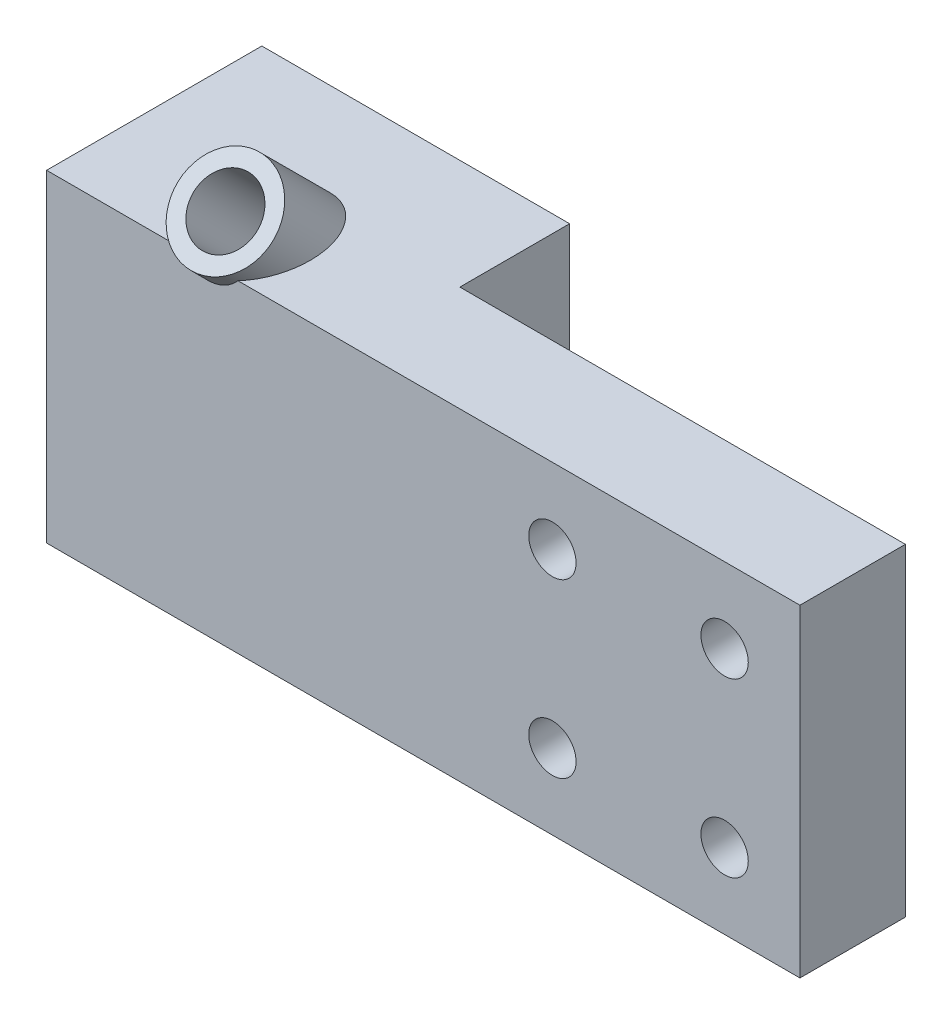
ISO-10303-21;
HEADER;
FILE_DESCRIPTION(('STEP AP214'),'2;1');
FILE_NAME('part.step','',(''),(''),'','','');
FILE_SCHEMA(('AUTOMOTIVE_DESIGN { 1 0 10303 214 1 1 1 1 }'));
ENDSEC;
DATA;
#1=APPLICATION_CONTEXT('core data for automotive mechanical design processes');
#2=APPLICATION_PROTOCOL_DEFINITION('international standard','automotive_design',2000,#1);
#3=PRODUCT_CONTEXT('',#1,'mechanical');
#4=PRODUCT('Part','Part','',(#3));
#5=PRODUCT_RELATED_PRODUCT_CATEGORY('part','',(#4));
#6=PRODUCT_DEFINITION_FORMATION('','',#4);
#7=PRODUCT_DEFINITION_CONTEXT('part definition',#1,'design');
#8=PRODUCT_DEFINITION('design','',#6,#7);
#9=PRODUCT_DEFINITION_SHAPE('','',#8);
#10=(LENGTH_UNIT() NAMED_UNIT(*) SI_UNIT(.MILLI.,.METRE.));
#11=(NAMED_UNIT(*) PLANE_ANGLE_UNIT() SI_UNIT($,.RADIAN.));
#12=(NAMED_UNIT(*) SI_UNIT($,.STERADIAN.) SOLID_ANGLE_UNIT());
#13=UNCERTAINTY_MEASURE_WITH_UNIT(LENGTH_MEASURE(1.E-05),#10,'distance_accuracy_value','');
#14=(GEOMETRIC_REPRESENTATION_CONTEXT(3) GLOBAL_UNCERTAINTY_ASSIGNED_CONTEXT((#13)) GLOBAL_UNIT_ASSIGNED_CONTEXT((#10,
#11,#12)) REPRESENTATION_CONTEXT('',''));
#15=CARTESIAN_POINT('',(0.,0.,0.));
#16=DIRECTION('',(0.,0.,1.));
#17=DIRECTION('',(1.,0.,0.));
#18=AXIS2_PLACEMENT_3D('',#15,#16,#17);
#19=CARTESIAN_POINT('',(0.,0.,-4.));
#20=DIRECTION('',(0.,0.,-1.));
#21=DIRECTION('',(1.,0.,0.));
#22=AXIS2_PLACEMENT_3D('',#19,#20,#21);
#23=PLANE('',#22);
#24=CARTESIAN_POINT('',(7.5,-7.5,-4.));
#25=DIRECTION('',(0.,0.,1.));
#26=DIRECTION('',(0.,-1.,0.));
#27=AXIS2_PLACEMENT_3D('',#24,#25,#26);
#28=ELLIPSE('',#27,3.18198051533947,2.25);
#29=CARTESIAN_POINT('',(7.5,-10.6819805153395,-4.));
#30=VERTEX_POINT('',#29);
#31=EDGE_CURVE('E11',#30,#30,#28,.T.);
#32=ORIENTED_EDGE('',*,*,#31,.T.);
#33=EDGE_LOOP('',(#32));
#34=FACE_BOUND('',#33,.T.);
#35=DIRECTION('',(1.,0.,0.));
#36=VECTOR('',#35,1.);
#37=CARTESIAN_POINT('',(0.,-15.,-4.));
#38=LINE('',#37,#36);
#39=CARTESIAN_POINT('',(0.,-15.,-4.));
#40=VERTEX_POINT('',#39);
#41=CARTESIAN_POINT('',(14.3,-15.,-4.));
#42=VERTEX_POINT('',#41);
#43=EDGE_CURVE('E121',#40,#42,#38,.T.);
#44=ORIENTED_EDGE('',*,*,#43,.F.);
#45=DIRECTION('',(0.,-1.,0.));
#46=VECTOR('',#45,1.);
#47=CARTESIAN_POINT('',(0.,0.,-4.));
#48=LINE('',#47,#46);
#49=CARTESIAN_POINT('',(0.,0.,-4.));
#50=VERTEX_POINT('',#49);
#51=EDGE_CURVE('E129',#50,#40,#48,.T.);
#52=ORIENTED_EDGE('',*,*,#51,.F.);
#53=DIRECTION('',(-1.,0.,0.));
#54=VECTOR('',#53,1.);
#55=CARTESIAN_POINT('',(0.,0.,-4.));
#56=LINE('',#55,#54);
#57=CARTESIAN_POINT('',(14.3,0.,-4.));
#58=VERTEX_POINT('',#57);
#59=EDGE_CURVE('E123',#58,#50,#56,.T.);
#60=ORIENTED_EDGE('',*,*,#59,.F.);
#61=DIRECTION('',(0.,-1.,0.));
#62=VECTOR('',#61,1.);
#63=CARTESIAN_POINT('',(14.3,0.,-4.));
#64=LINE('',#63,#62);
#65=EDGE_CURVE('E109',#58,#42,#64,.T.);
#66=ORIENTED_EDGE('',*,*,#65,.T.);
#67=EDGE_LOOP('',(#44,#52,#60,#66));
#68=FACE_BOUND('',#67,.T.);
#69=ADVANCED_FACE('F41',(#34,#68),#23,.T.);
#70=CARTESIAN_POINT('',(0.,0.,-4.));
#71=DIRECTION('',(1.,0.,0.));
#72=DIRECTION('',(0.,1.,0.));
#73=AXIS2_PLACEMENT_3D('',#70,#71,#72);
#74=PLANE('',#73);
#75=DIRECTION('',(0.,0.,1.));
#76=VECTOR('',#75,1.);
#77=CARTESIAN_POINT('',(0.,0.,-4.));
#78=LINE('',#77,#76);
#79=CARTESIAN_POINT('',(0.,0.,6.));
#80=VERTEX_POINT('',#79);
#81=EDGE_CURVE('E132',#50,#80,#78,.T.);
#82=ORIENTED_EDGE('',*,*,#81,.F.);
#83=ORIENTED_EDGE('',*,*,#51,.T.);
#84=DIRECTION('',(0.,0.,1.));
#85=VECTOR('',#84,1.);
#86=CARTESIAN_POINT('',(0.,-15.,-4.));
#87=LINE('',#86,#85);
#88=CARTESIAN_POINT('',(0.,-15.,6.));
#89=VERTEX_POINT('',#88);
#90=EDGE_CURVE('E130',#40,#89,#87,.T.);
#91=ORIENTED_EDGE('',*,*,#90,.T.);
#92=DIRECTION('',(0.,-1.,0.));
#93=VECTOR('',#92,1.);
#94=CARTESIAN_POINT('',(0.,0.,6.));
#95=LINE('',#94,#93);
#96=EDGE_CURVE('E152',#80,#89,#95,.T.);
#97=ORIENTED_EDGE('',*,*,#96,.F.);
#98=EDGE_LOOP('',(#82,#83,#91,#97));
#99=FACE_BOUND('',#98,.T.);
#100=ADVANCED_FACE('F43',(#99),#74,.F.);
#101=CARTESIAN_POINT('',(0.,-15.,-4.));
#102=DIRECTION('',(0.,1.,0.));
#103=DIRECTION('',(0.,0.,-1.));
#104=AXIS2_PLACEMENT_3D('',#101,#102,#103);
#105=PLANE('',#104);
#106=DIRECTION('',(1.,0.,0.));
#107=VECTOR('',#106,1.);
#108=CARTESIAN_POINT('',(0.,-15.,1.1));
#109=LINE('',#108,#107);
#110=CARTESIAN_POINT('',(14.3,-15.,1.1));
#111=VERTEX_POINT('',#110);
#112=CARTESIAN_POINT('',(35.,-15.,1.1));
#113=VERTEX_POINT('',#112);
#114=EDGE_CURVE('E334',#111,#113,#109,.T.);
#115=ORIENTED_EDGE('',*,*,#114,.T.);
#116=DIRECTION('',(0.,0.,-1.));
#117=VECTOR('',#116,1.);
#118=CARTESIAN_POINT('',(35.,-15.,6.));
#119=LINE('',#118,#117);
#120=CARTESIAN_POINT('',(35.,-15.,6.));
#121=VERTEX_POINT('',#120);
#122=EDGE_CURVE('E356',#121,#113,#119,.T.);
#123=ORIENTED_EDGE('',*,*,#122,.F.);
#124=DIRECTION('',(1.,0.,0.));
#125=VECTOR('',#124,1.);
#126=CARTESIAN_POINT('',(0.,-15.,6.));
#127=LINE('',#126,#125);
#128=EDGE_CURVE('E346',#89,#121,#127,.T.);
#129=ORIENTED_EDGE('',*,*,#128,.F.);
#130=ORIENTED_EDGE('',*,*,#90,.F.);
#131=ORIENTED_EDGE('',*,*,#43,.T.);
#132=DIRECTION('',(0.,0.,1.));
#133=VECTOR('',#132,1.);
#134=CARTESIAN_POINT('',(14.3,-15.,-4.));
#135=LINE('',#134,#133);
#136=EDGE_CURVE('E106',#42,#111,#135,.T.);
#137=ORIENTED_EDGE('',*,*,#136,.T.);
#138=EDGE_LOOP('',(#115,#123,#129,#130,#131,#137));
#139=FACE_BOUND('',#138,.T.);
#140=ADVANCED_FACE('F124',(#139),#105,.F.);
#141=CARTESIAN_POINT('',(0.,0.,-4.));
#142=DIRECTION('',(0.,-1.,0.));
#143=DIRECTION('',(0.,0.,1.));
#144=AXIS2_PLACEMENT_3D('',#141,#142,#143);
#145=PLANE('',#144);
#146=DIRECTION('',(0.,0.,-1.));
#147=VECTOR('',#146,1.);
#148=CARTESIAN_POINT('',(14.3,0.,-4.));
#149=LINE('',#148,#147);
#150=CARTESIAN_POINT('',(14.3,0.,1.1));
#151=VERTEX_POINT('',#150);
#152=EDGE_CURVE('E320',#151,#58,#149,.T.);
#153=ORIENTED_EDGE('',*,*,#152,.T.);
#154=ORIENTED_EDGE('',*,*,#59,.T.);
#155=ORIENTED_EDGE('',*,*,#81,.T.);
#156=DIRECTION('',(-1.,0.,0.));
#157=VECTOR('',#156,1.);
#158=CARTESIAN_POINT('',(0.,0.,6.));
#159=LINE('',#158,#157);
#160=CARTESIAN_POINT('',(6.10805890929252,0.,6.));
#161=VERTEX_POINT('',#160);
#162=EDGE_CURVE('E354',#161,#80,#159,.T.);
#163=ORIENTED_EDGE('',*,*,#162,.F.);
#164=CARTESIAN_POINT('',(7.5,0.,3.49999999999997));
#165=DIRECTION('',(0.,1.,0.));
#166=DIRECTION('',(0.,0.,-1.));
#167=AXIS2_PLACEMENT_3D('',#164,#165,#166);
#168=ELLIPSE('',#167,3.18198051533946,2.25);
#169=CARTESIAN_POINT('',(8.89194109070747,0.,6.));
#170=VERTEX_POINT('',#169);
#171=EDGE_CURVE('E329',#170,#161,#168,.T.);
#172=ORIENTED_EDGE('',*,*,#171,.F.);
#173=CARTESIAN_POINT('',(35.,0.,6.));
#174=VERTEX_POINT('',#173);
#175=EDGE_CURVE('E351',#174,#170,#159,.T.);
#176=ORIENTED_EDGE('',*,*,#175,.F.);
#177=DIRECTION('',(0.,0.,-1.));
#178=VECTOR('',#177,1.);
#179=CARTESIAN_POINT('',(35.,0.,6.));
#180=LINE('',#179,#178);
#181=CARTESIAN_POINT('',(35.,0.,1.1));
#182=VERTEX_POINT('',#181);
#183=EDGE_CURVE('E134',#174,#182,#180,.T.);
#184=ORIENTED_EDGE('',*,*,#183,.T.);
#185=DIRECTION('',(1.,0.,0.));
#186=VECTOR('',#185,1.);
#187=CARTESIAN_POINT('',(0.,0.,1.1));
#188=LINE('',#187,#186);
#189=EDGE_CURVE('E144',#151,#182,#188,.T.);
#190=ORIENTED_EDGE('',*,*,#189,.F.);
#191=EDGE_LOOP('',(#153,#154,#155,#163,#172,#176,#184,#190));
#192=FACE_BOUND('',#191,.T.);
#193=ADVANCED_FACE('F189',(#192),#145,.F.);
#194=CARTESIAN_POINT('',(35.,0.,6.));
#195=DIRECTION('',(1.,0.,0.));
#196=DIRECTION('',(0.,0.,1.));
#197=AXIS2_PLACEMENT_3D('',#194,#195,#196);
#198=PLANE('',#197);
#199=DIRECTION('',(0.,-1.,0.));
#200=VECTOR('',#199,1.);
#201=CARTESIAN_POINT('',(35.,14.,1.1));
#202=LINE('',#201,#200);
#203=EDGE_CURVE('E158',#182,#113,#202,.T.);
#204=ORIENTED_EDGE('',*,*,#203,.F.);
#205=ORIENTED_EDGE('',*,*,#183,.F.);
#206=DIRECTION('',(0.,1.,0.));
#207=VECTOR('',#206,1.);
#208=CARTESIAN_POINT('',(35.,0.,6.));
#209=LINE('',#208,#207);
#210=EDGE_CURVE('E352',#121,#174,#209,.T.);
#211=ORIENTED_EDGE('',*,*,#210,.F.);
#212=ORIENTED_EDGE('',*,*,#122,.T.);
#213=EDGE_LOOP('',(#204,#205,#211,#212));
#214=FACE_BOUND('',#213,.T.);
#215=ADVANCED_FACE('F187',(#214),#198,.T.);
#216=CARTESIAN_POINT('',(0.,0.,6.));
#217=DIRECTION('',(0.,0.,-1.));
#218=DIRECTION('',(1.,0.,0.));
#219=AXIS2_PLACEMENT_3D('',#216,#217,#218);
#220=PLANE('',#219);
#221=CARTESIAN_POINT('',(23.5,-3.50000000000005,6.));
#222=DIRECTION('',(0.,0.,1.));
#223=DIRECTION('',(1.,0.,0.));
#224=AXIS2_PLACEMENT_3D('',#221,#222,#223);
#225=CIRCLE('',#224,1.1);
#226=CARTESIAN_POINT('',(24.6,-3.50000000000005,6.));
#227=VERTEX_POINT('',#226);
#228=EDGE_CURVE('E151',#227,#227,#225,.T.);
#229=ORIENTED_EDGE('',*,*,#228,.F.);
#230=EDGE_LOOP('',(#229));
#231=FACE_BOUND('',#230,.T.);
#232=CARTESIAN_POINT('',(23.5000000000001,-11.5000000000001,6.));
#233=DIRECTION('',(0.,0.,1.));
#234=DIRECTION('',(1.,0.,0.));
#235=AXIS2_PLACEMENT_3D('',#232,#233,#234);
#236=CIRCLE('',#235,1.1);
#237=CARTESIAN_POINT('',(24.6000000000001,-11.5000000000001,6.));
#238=VERTEX_POINT('',#237);
#239=EDGE_CURVE('E146',#238,#238,#236,.T.);
#240=ORIENTED_EDGE('',*,*,#239,.F.);
#241=EDGE_LOOP('',(#240));
#242=FACE_BOUND('',#241,.T.);
#243=CARTESIAN_POINT('',(31.5000000000001,-11.5,6.));
#244=DIRECTION('',(0.,0.,1.));
#245=DIRECTION('',(1.,0.,0.));
#246=AXIS2_PLACEMENT_3D('',#243,#244,#245);
#247=CIRCLE('',#246,1.1);
#248=CARTESIAN_POINT('',(32.6000000000001,-11.5,6.));
#249=VERTEX_POINT('',#248);
#250=EDGE_CURVE('E145',#249,#249,#247,.T.);
#251=ORIENTED_EDGE('',*,*,#250,.F.);
#252=EDGE_LOOP('',(#251));
#253=FACE_BOUND('',#252,.T.);
#254=CARTESIAN_POINT('',(31.5,-3.5,6.));
#255=DIRECTION('',(0.,0.,1.));
#256=DIRECTION('',(1.,0.,0.));
#257=AXIS2_PLACEMENT_3D('',#254,#255,#256);
#258=CIRCLE('',#257,1.1);
#259=CARTESIAN_POINT('',(32.6,-3.5,6.));
#260=VERTEX_POINT('',#259);
#261=EDGE_CURVE('E143',#260,#260,#258,.T.);
#262=ORIENTED_EDGE('',*,*,#261,.F.);
#263=EDGE_LOOP('',(#262));
#264=FACE_BOUND('',#263,.T.);
#265=ORIENTED_EDGE('',*,*,#162,.T.);
#266=ORIENTED_EDGE('',*,*,#96,.T.);
#267=ORIENTED_EDGE('',*,*,#128,.T.);
#268=ORIENTED_EDGE('',*,*,#210,.T.);
#269=ORIENTED_EDGE('',*,*,#175,.T.);
#270=CARTESIAN_POINT('',(7.5,2.50000000000003,6.));
#271=DIRECTION('',(0.,0.,1.));
#272=DIRECTION('',(0.,-1.,0.));
#273=AXIS2_PLACEMENT_3D('',#270,#271,#272);
#274=ELLIPSE('',#273,3.18198051533947,2.25);
#275=EDGE_CURVE('E44',#161,#170,#274,.T.);
#276=ORIENTED_EDGE('',*,*,#275,.F.);
#277=EDGE_LOOP('',(#265,#266,#267,#268,#269,#276));
#278=FACE_BOUND('',#277,.T.);
#279=ADVANCED_FACE('F208',(#231,#242,#253,#264,#278),#220,.F.);
#280=CARTESIAN_POINT('',(31.5,-3.5,25.));
#281=DIRECTION('',(0.,0.,-1.));
#282=DIRECTION('',(1.,0.,0.));
#283=AXIS2_PLACEMENT_3D('',#280,#281,#282);
#284=CYLINDRICAL_SURFACE('',#283,1.1);
#285=CARTESIAN_POINT('',(31.5,-3.5,1.1));
#286=DIRECTION('',(0.,0.,-1.));
#287=DIRECTION('',(-1.,0.,0.));
#288=AXIS2_PLACEMENT_3D('',#285,#286,#287);
#289=CIRCLE('',#288,1.1);
#290=CARTESIAN_POINT('',(30.4,-3.5,1.1));
#291=VERTEX_POINT('',#290);
#292=EDGE_CURVE('E341',#291,#291,#289,.F.);
#293=ORIENTED_EDGE('',*,*,#292,.F.);
#294=EDGE_LOOP('',(#293));
#295=FACE_BOUND('',#294,.T.);
#296=ORIENTED_EDGE('',*,*,#261,.T.);
#297=EDGE_LOOP('',(#296));
#298=FACE_BOUND('',#297,.T.);
#299=ADVANCED_FACE('F214',(#295,#298),#284,.F.);
#300=CARTESIAN_POINT('',(31.5000000000001,-11.5,25.));
#301=DIRECTION('',(0.,0.,-1.));
#302=DIRECTION('',(1.,0.,0.));
#303=AXIS2_PLACEMENT_3D('',#300,#301,#302);
#304=CYLINDRICAL_SURFACE('',#303,1.1);
#305=CARTESIAN_POINT('',(31.5000000000001,-11.5,1.1));
#306=DIRECTION('',(0.,0.,-1.));
#307=DIRECTION('',(-1.,0.,0.));
#308=AXIS2_PLACEMENT_3D('',#305,#306,#307);
#309=CIRCLE('',#308,1.1);
#310=CARTESIAN_POINT('',(30.4000000000001,-11.5,1.1));
#311=VERTEX_POINT('',#310);
#312=EDGE_CURVE('E339',#311,#311,#309,.F.);
#313=ORIENTED_EDGE('',*,*,#312,.F.);
#314=EDGE_LOOP('',(#313));
#315=FACE_BOUND('',#314,.T.);
#316=ORIENTED_EDGE('',*,*,#250,.T.);
#317=EDGE_LOOP('',(#316));
#318=FACE_BOUND('',#317,.T.);
#319=ADVANCED_FACE('F225',(#315,#318),#304,.F.);
#320=CARTESIAN_POINT('',(23.5000000000001,-11.5000000000001,25.));
#321=DIRECTION('',(0.,0.,-1.));
#322=DIRECTION('',(1.,0.,0.));
#323=AXIS2_PLACEMENT_3D('',#320,#321,#322);
#324=CYLINDRICAL_SURFACE('',#323,1.1);
#325=CARTESIAN_POINT('',(23.5000000000001,-11.5000000000001,1.1));
#326=DIRECTION('',(0.,0.,-1.));
#327=DIRECTION('',(-1.,0.,0.));
#328=AXIS2_PLACEMENT_3D('',#325,#326,#327);
#329=CIRCLE('',#328,1.1);
#330=CARTESIAN_POINT('',(22.4000000000001,-11.5000000000001,1.1));
#331=VERTEX_POINT('',#330);
#332=EDGE_CURVE('E160',#331,#331,#329,.F.);
#333=ORIENTED_EDGE('',*,*,#332,.F.);
#334=EDGE_LOOP('',(#333));
#335=FACE_BOUND('',#334,.T.);
#336=ORIENTED_EDGE('',*,*,#239,.T.);
#337=EDGE_LOOP('',(#336));
#338=FACE_BOUND('',#337,.T.);
#339=ADVANCED_FACE('F228',(#335,#338),#324,.F.);
#340=CARTESIAN_POINT('',(23.5,-3.50000000000005,25.));
#341=DIRECTION('',(0.,0.,-1.));
#342=DIRECTION('',(1.,0.,0.));
#343=AXIS2_PLACEMENT_3D('',#340,#341,#342);
#344=CYLINDRICAL_SURFACE('',#343,1.1);
#345=CARTESIAN_POINT('',(23.5,-3.50000000000005,1.1));
#346=DIRECTION('',(0.,0.,-1.));
#347=DIRECTION('',(-1.,0.,0.));
#348=AXIS2_PLACEMENT_3D('',#345,#346,#347);
#349=CIRCLE('',#348,1.1);
#350=CARTESIAN_POINT('',(22.4,-3.50000000000005,1.1));
#351=VERTEX_POINT('',#350);
#352=EDGE_CURVE('E154',#351,#351,#349,.F.);
#353=ORIENTED_EDGE('',*,*,#352,.F.);
#354=EDGE_LOOP('',(#353));
#355=FACE_BOUND('',#354,.T.);
#356=ORIENTED_EDGE('',*,*,#228,.T.);
#357=EDGE_LOOP('',(#356));
#358=FACE_BOUND('',#357,.T.);
#359=ADVANCED_FACE('F236',(#355,#358),#344,.F.);
#360=CARTESIAN_POINT('',(0.,14.,1.1));
#361=DIRECTION('',(0.,0.,1.));
#362=DIRECTION('',(-1.,0.,0.));
#363=AXIS2_PLACEMENT_3D('',#360,#361,#362);
#364=PLANE('',#363);
#365=ORIENTED_EDGE('',*,*,#312,.T.);
#366=EDGE_LOOP('',(#365));
#367=FACE_BOUND('',#366,.T.);
#368=ORIENTED_EDGE('',*,*,#352,.T.);
#369=EDGE_LOOP('',(#368));
#370=FACE_BOUND('',#369,.T.);
#371=ORIENTED_EDGE('',*,*,#332,.T.);
#372=EDGE_LOOP('',(#371));
#373=FACE_BOUND('',#372,.T.);
#374=ORIENTED_EDGE('',*,*,#292,.T.);
#375=EDGE_LOOP('',(#374));
#376=FACE_BOUND('',#375,.T.);
#377=ORIENTED_EDGE('',*,*,#189,.T.);
#378=ORIENTED_EDGE('',*,*,#203,.T.);
#379=ORIENTED_EDGE('',*,*,#114,.F.);
#380=DIRECTION('',(0.,1.,0.));
#381=VECTOR('',#380,1.);
#382=CARTESIAN_POINT('',(14.3,0.,1.1));
#383=LINE('',#382,#381);
#384=EDGE_CURVE('E115',#111,#151,#383,.T.);
#385=ORIENTED_EDGE('',*,*,#384,.T.);
#386=EDGE_LOOP('',(#377,#378,#379,#385));
#387=FACE_BOUND('',#386,.T.);
#388=ADVANCED_FACE('F246',(#367,#370,#373,#376,#387),#364,.F.);
#389=CARTESIAN_POINT('',(7.5,1.69238815542513,5.1923881554251));
#390=DIRECTION('',(0.,-0.707106781186549,-0.707106781186546));
#391=DIRECTION('',(0.,-0.707106781186546,0.707106781186549));
#392=AXIS2_PLACEMENT_3D('',#389,#390,#391);
#393=PLANE('',#392);
#394=CARTESIAN_POINT('',(7.5,1.69238815542513,5.1923881554251));
#395=DIRECTION('',(0.,0.707106781186549,0.707106781186546));
#396=DIRECTION('',(0.,-0.707106781186546,0.707106781186549));
#397=AXIS2_PLACEMENT_3D('',#394,#395,#396);
#398=CIRCLE('',#397,1.5);
#399=CARTESIAN_POINT('',(7.5,0.631727983645316,6.25304832720492));
#400=VERTEX_POINT('',#399);
#401=EDGE_CURVE('E317',#400,#400,#398,.T.);
#402=ORIENTED_EDGE('',*,*,#401,.F.);
#403=EDGE_LOOP('',(#402));
#404=FACE_BOUND('',#403,.T.);
#405=CARTESIAN_POINT('',(7.5,1.69238815542513,5.1923881554251));
#406=DIRECTION('',(0.,0.707106781186549,0.707106781186546));
#407=DIRECTION('',(0.,-0.707106781186546,0.707106781186549));
#408=AXIS2_PLACEMENT_3D('',#405,#406,#407);
#409=CIRCLE('',#408,2.25);
#410=CARTESIAN_POINT('',(7.5,0.101397897755405,6.78337841309484));
#411=VERTEX_POINT('',#410);
#412=EDGE_CURVE('E326',#411,#411,#409,.T.);
#413=ORIENTED_EDGE('',*,*,#412,.T.);
#414=EDGE_LOOP('',(#413));
#415=FACE_BOUND('',#414,.T.);
#416=ADVANCED_FACE('F254',(#404,#415),#393,.F.);
#417=CARTESIAN_POINT('',(7.5,1.69238815542513,5.1923881554251));
#418=DIRECTION('',(0.,-0.707106781186549,-0.707106781186546));
#419=DIRECTION('',(0.,-0.707106781186546,0.707106781186549));
#420=AXIS2_PLACEMENT_3D('',#417,#418,#419);
#421=CYLINDRICAL_SURFACE('',#420,2.25);
#422=ORIENTED_EDGE('',*,*,#412,.F.);
#423=EDGE_LOOP('',(#422));
#424=FACE_BOUND('',#423,.T.);
#425=ORIENTED_EDGE('',*,*,#171,.T.);
#426=ORIENTED_EDGE('',*,*,#275,.T.);
#427=EDGE_LOOP('',(#425,#426));
#428=FACE_BOUND('',#427,.T.);
#429=ADVANCED_FACE('F173',(#424,#428),#421,.T.);
#430=DIRECTION('',(1.,0.,0.));
#431=VECTOR('',#430,1.);
#432=CARTESIAN_POINT('',(7.5,-7.5,-4.));
#433=LINE('',#432,#431);
#434=CARTESIAN_POINT('',(6.,-7.5,-4.));
#435=VERTEX_POINT('',#434);
#436=CARTESIAN_POINT('',(9.,-7.5,-4.));
#437=VERTEX_POINT('',#436);
#438=EDGE_CURVE('E139',#435,#437,#433,.T.);
#439=ORIENTED_EDGE('',*,*,#438,.T.);
#440=CARTESIAN_POINT('',(7.5,-7.5,-4.));
#441=DIRECTION('',(0.,0.,1.));
#442=DIRECTION('',(0.,-1.,0.));
#443=AXIS2_PLACEMENT_3D('',#440,#441,#442);
#444=ELLIPSE('',#443,2.12132034355964,1.5);
#445=EDGE_CURVE('E162',#435,#437,#444,.T.);
#446=ORIENTED_EDGE('',*,*,#445,.F.);
#447=EDGE_LOOP('',(#439,#446));
#448=FACE_BOUND('',#447,.T.);
#449=ADVANCED_FACE('F165',(#448),#23,.T.);
#450=CARTESIAN_POINT('',(7.5,-7.5,-4.));
#451=DIRECTION('',(0.,-0.707106781186549,-0.707106781186546));
#452=DIRECTION('',(0.,-0.707106781186546,0.707106781186549));
#453=AXIS2_PLACEMENT_3D('',#450,#451,#452);
#454=PLANE('',#453);
#455=CARTESIAN_POINT('',(7.5,-7.5,-4.));
#456=DIRECTION('',(0.,0.707106781186549,0.707106781186546));
#457=DIRECTION('',(0.,-0.707106781186546,0.707106781186549));
#458=AXIS2_PLACEMENT_3D('',#455,#456,#457);
#459=CIRCLE('',#458,1.5);
#460=EDGE_CURVE('E65',#435,#437,#459,.T.);
#461=ORIENTED_EDGE('',*,*,#460,.T.);
#462=ORIENTED_EDGE('',*,*,#438,.F.);
#463=EDGE_LOOP('',(#461,#462));
#464=FACE_BOUND('',#463,.T.);
#465=ADVANCED_FACE('F163',(#464),#454,.F.);
#466=CARTESIAN_POINT('',(7.5,1.69238815542513,5.1923881554251));
#467=DIRECTION('',(0.,-0.707106781186549,-0.707106781186546));
#468=DIRECTION('',(0.,-0.707106781186546,0.707106781186549));
#469=AXIS2_PLACEMENT_3D('',#466,#467,#468);
#470=CYLINDRICAL_SURFACE('',#469,1.5);
#471=ORIENTED_EDGE('',*,*,#460,.F.);
#472=ORIENTED_EDGE('',*,*,#445,.T.);
#473=EDGE_LOOP('',(#471,#472));
#474=FACE_BOUND('',#473,.T.);
#475=ORIENTED_EDGE('',*,*,#401,.T.);
#476=EDGE_LOOP('',(#475));
#477=FACE_BOUND('',#476,.T.);
#478=CARTESIAN_POINT('',(7.5,-10.3284271247462,-6.82842712474618));
#479=DIRECTION('',(0.,0.707106781186549,0.707106781186546));
#480=DIRECTION('',(0.,-0.707106781186546,0.707106781186549));
#481=AXIS2_PLACEMENT_3D('',#478,#479,#480);
#482=CIRCLE('',#481,1.5);
#483=CARTESIAN_POINT('',(7.5,-11.389087296526,-5.76776695296636));
#484=VERTEX_POINT('',#483);
#485=EDGE_CURVE('E312',#484,#484,#482,.T.);
#486=ORIENTED_EDGE('',*,*,#485,.F.);
#487=EDGE_LOOP('',(#486));
#488=FACE_BOUND('',#487,.T.);
#489=ADVANCED_FACE('F167',(#474,#477,#488),#470,.F.);
#490=ORIENTED_EDGE('',*,*,#31,.F.);
#491=EDGE_LOOP('',(#490));
#492=FACE_BOUND('',#491,.T.);
#493=CARTESIAN_POINT('',(7.5,-10.3284271247462,-6.82842712474618));
#494=DIRECTION('',(0.,0.707106781186549,0.707106781186546));
#495=DIRECTION('',(0.,-0.707106781186546,0.707106781186549));
#496=AXIS2_PLACEMENT_3D('',#493,#494,#495);
#497=CIRCLE('',#496,2.25);
#498=CARTESIAN_POINT('',(7.5,-11.9194173824159,-5.23743686707645));
#499=VERTEX_POINT('',#498);
#500=EDGE_CURVE('E315',#499,#499,#497,.T.);
#501=ORIENTED_EDGE('',*,*,#500,.T.);
#502=EDGE_LOOP('',(#501));
#503=FACE_BOUND('',#502,.T.);
#504=ADVANCED_FACE('F175',(#492,#503),#421,.T.);
#505=CARTESIAN_POINT('',(7.5,-10.3284271247462,-6.82842712474618));
#506=DIRECTION('',(0.,-0.707106781186549,-0.707106781186546));
#507=DIRECTION('',(0.,-0.707106781186546,0.707106781186549));
#508=AXIS2_PLACEMENT_3D('',#505,#506,#507);
#509=PLANE('',#508);
#510=ORIENTED_EDGE('',*,*,#500,.F.);
#511=EDGE_LOOP('',(#510));
#512=FACE_BOUND('',#511,.T.);
#513=ORIENTED_EDGE('',*,*,#485,.T.);
#514=EDGE_LOOP('',(#513));
#515=FACE_BOUND('',#514,.T.);
#516=ADVANCED_FACE('F294',(#512,#515),#509,.T.);
#517=CARTESIAN_POINT('',(14.3,0.,0.));
#518=DIRECTION('',(1.,0.,0.));
#519=DIRECTION('',(0.,0.,1.));
#520=AXIS2_PLACEMENT_3D('',#517,#518,#519);
#521=PLANE('',#520);
#522=ORIENTED_EDGE('',*,*,#65,.F.);
#523=ORIENTED_EDGE('',*,*,#152,.F.);
#524=ORIENTED_EDGE('',*,*,#384,.F.);
#525=ORIENTED_EDGE('',*,*,#136,.F.);
#526=EDGE_LOOP('',(#522,#523,#524,#525));
#527=FACE_BOUND('',#526,.T.);
#528=ADVANCED_FACE('F107',(#527),#521,.T.);
#529=CLOSED_SHELL('',(#69,#100,#140,#193,#215,#279,#299,#319,#339,#359,#388,#416,#429,#449,#465,
#489,#504,#516,#528));
#530=MANIFOLD_SOLID_BREP('B2',#529);
#531=ADVANCED_BREP_SHAPE_REPRESENTATION('',(#18,#530),#14);
#532=SHAPE_DEFINITION_REPRESENTATION(#9,#531);
ENDSEC;
END-ISO-10303-21;
